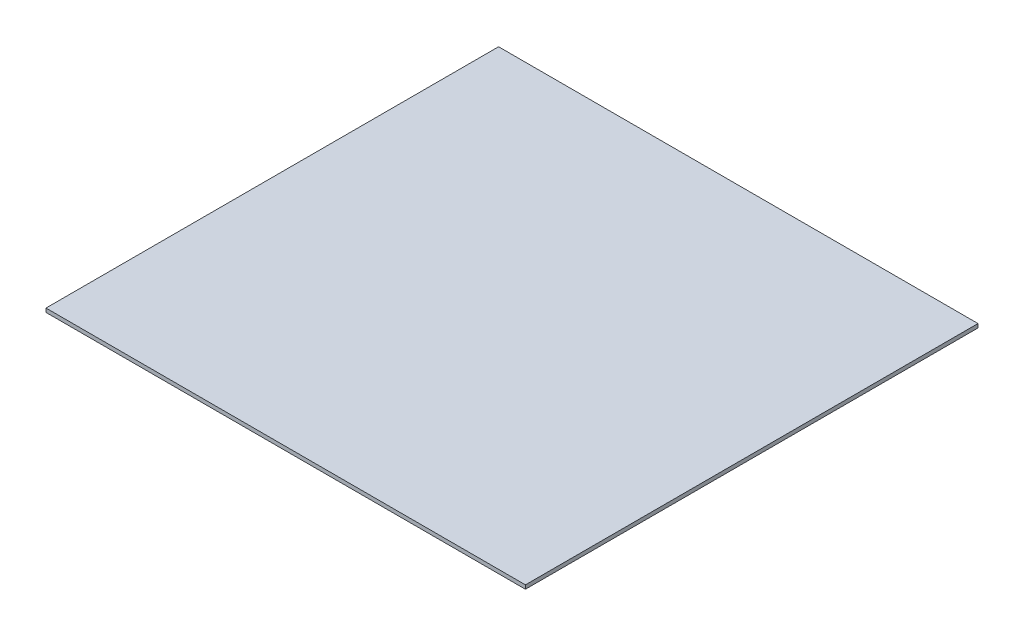
ISO-10303-21;
HEADER;
FILE_DESCRIPTION(('STEP AP214'),'2;1');
FILE_NAME('part.step','',(''),(''),'','','');
FILE_SCHEMA(('AUTOMOTIVE_DESIGN { 1 0 10303 214 1 1 1 1 }'));
ENDSEC;
DATA;
#1=APPLICATION_CONTEXT('core data for automotive mechanical design processes');
#2=APPLICATION_PROTOCOL_DEFINITION('international standard','automotive_design',2000,#1);
#3=PRODUCT_CONTEXT('',#1,'mechanical');
#4=PRODUCT('Part','Part','',(#3));
#5=PRODUCT_RELATED_PRODUCT_CATEGORY('part','',(#4));
#6=PRODUCT_DEFINITION_FORMATION('','',#4);
#7=PRODUCT_DEFINITION_CONTEXT('part definition',#1,'design');
#8=PRODUCT_DEFINITION('design','',#6,#7);
#9=PRODUCT_DEFINITION_SHAPE('','',#8);
#10=(LENGTH_UNIT() NAMED_UNIT(*) SI_UNIT(.MILLI.,.METRE.));
#11=(NAMED_UNIT(*) PLANE_ANGLE_UNIT() SI_UNIT($,.RADIAN.));
#12=(NAMED_UNIT(*) SI_UNIT($,.STERADIAN.) SOLID_ANGLE_UNIT());
#13=UNCERTAINTY_MEASURE_WITH_UNIT(LENGTH_MEASURE(1.E-05),#10,'distance_accuracy_value','');
#14=(GEOMETRIC_REPRESENTATION_CONTEXT(3) GLOBAL_UNCERTAINTY_ASSIGNED_CONTEXT((#13)) GLOBAL_UNIT_ASSIGNED_CONTEXT((#10,
#11,#12)) REPRESENTATION_CONTEXT('',''));
#15=CARTESIAN_POINT('',(0.,0.,0.));
#16=DIRECTION('',(0.,0.,1.));
#17=DIRECTION('',(1.,0.,0.));
#18=AXIS2_PLACEMENT_3D('',#15,#16,#17);
#19=CARTESIAN_POINT('',(312.5,5.,-295.));
#20=DIRECTION('',(-1.,0.,0.));
#21=DIRECTION('',(0.,0.,1.));
#22=AXIS2_PLACEMENT_3D('',#19,#20,#21);
#23=PLANE('',#22);
#24=DIRECTION('',(0.,0.,-1.));
#25=VECTOR('',#24,1.);
#26=CARTESIAN_POINT('',(312.5,0.,-295.));
#27=LINE('',#26,#25);
#28=CARTESIAN_POINT('',(312.5,0.,295.));
#29=VERTEX_POINT('',#28);
#30=CARTESIAN_POINT('',(312.5,0.,-295.));
#31=VERTEX_POINT('',#30);
#32=EDGE_CURVE('E113',#29,#31,#27,.T.);
#33=ORIENTED_EDGE('',*,*,#32,.T.);
#34=DIRECTION('',(0.,-1.,0.));
#35=VECTOR('',#34,1.);
#36=CARTESIAN_POINT('',(312.5,5.,-295.));
#37=LINE('',#36,#35);
#38=CARTESIAN_POINT('',(312.5,5.,-295.));
#39=VERTEX_POINT('',#38);
#40=EDGE_CURVE('E11',#39,#31,#37,.T.);
#41=ORIENTED_EDGE('',*,*,#40,.F.);
#42=DIRECTION('',(0.,0.,-1.));
#43=VECTOR('',#42,1.);
#44=CARTESIAN_POINT('',(312.5,5.,-295.));
#45=LINE('',#44,#43);
#46=CARTESIAN_POINT('',(312.5,5.,295.));
#47=VERTEX_POINT('',#46);
#48=EDGE_CURVE('E97',#47,#39,#45,.T.);
#49=ORIENTED_EDGE('',*,*,#48,.F.);
#50=DIRECTION('',(0.,-1.,0.));
#51=VECTOR('',#50,1.);
#52=CARTESIAN_POINT('',(312.5,5.,295.));
#53=LINE('',#52,#51);
#54=EDGE_CURVE('E109',#47,#29,#53,.T.);
#55=ORIENTED_EDGE('',*,*,#54,.T.);
#56=EDGE_LOOP('',(#33,#41,#49,#55));
#57=FACE_BOUND('',#56,.T.);
#58=ADVANCED_FACE('F45',(#57),#23,.F.);
#59=CARTESIAN_POINT('',(-312.5,5.,-295.));
#60=DIRECTION('',(0.,0.,1.));
#61=DIRECTION('',(1.,0.,0.));
#62=AXIS2_PLACEMENT_3D('',#59,#60,#61);
#63=PLANE('',#62);
#64=DIRECTION('',(-1.,0.,0.));
#65=VECTOR('',#64,1.);
#66=CARTESIAN_POINT('',(-312.5,0.,-295.));
#67=LINE('',#66,#65);
#68=CARTESIAN_POINT('',(-312.5,0.,-295.));
#69=VERTEX_POINT('',#68);
#70=EDGE_CURVE('E102',#31,#69,#67,.T.);
#71=ORIENTED_EDGE('',*,*,#70,.T.);
#72=DIRECTION('',(0.,-1.,0.));
#73=VECTOR('',#72,1.);
#74=CARTESIAN_POINT('',(-312.5,5.,-295.));
#75=LINE('',#74,#73);
#76=CARTESIAN_POINT('',(-312.5,5.,-295.));
#77=VERTEX_POINT('',#76);
#78=EDGE_CURVE('E54',#77,#69,#75,.T.);
#79=ORIENTED_EDGE('',*,*,#78,.F.);
#80=DIRECTION('',(-1.,0.,0.));
#81=VECTOR('',#80,1.);
#82=CARTESIAN_POINT('',(-312.5,5.,-295.));
#83=LINE('',#82,#81);
#84=EDGE_CURVE('E92',#39,#77,#83,.T.);
#85=ORIENTED_EDGE('',*,*,#84,.F.);
#86=ORIENTED_EDGE('',*,*,#40,.T.);
#87=EDGE_LOOP('',(#71,#79,#85,#86));
#88=FACE_BOUND('',#87,.T.);
#89=ADVANCED_FACE('F101',(#88),#63,.F.);
#90=CARTESIAN_POINT('',(-312.5,5.,-295.));
#91=DIRECTION('',(1.,0.,0.));
#92=DIRECTION('',(0.,0.,-1.));
#93=AXIS2_PLACEMENT_3D('',#90,#91,#92);
#94=PLANE('',#93);
#95=DIRECTION('',(0.,0.,1.));
#96=VECTOR('',#95,1.);
#97=CARTESIAN_POINT('',(-312.5,0.,-295.));
#98=LINE('',#97,#96);
#99=CARTESIAN_POINT('',(-312.5,0.,295.));
#100=VERTEX_POINT('',#99);
#101=EDGE_CURVE('E79',#69,#100,#98,.T.);
#102=ORIENTED_EDGE('',*,*,#101,.T.);
#103=DIRECTION('',(0.,-1.,0.));
#104=VECTOR('',#103,1.);
#105=CARTESIAN_POINT('',(-312.5,5.,295.));
#106=LINE('',#105,#104);
#107=CARTESIAN_POINT('',(-312.5,5.,295.));
#108=VERTEX_POINT('',#107);
#109=EDGE_CURVE('E104',#108,#100,#106,.T.);
#110=ORIENTED_EDGE('',*,*,#109,.F.);
#111=DIRECTION('',(0.,0.,1.));
#112=VECTOR('',#111,1.);
#113=CARTESIAN_POINT('',(-312.5,5.,-295.));
#114=LINE('',#113,#112);
#115=EDGE_CURVE('E95',#77,#108,#114,.T.);
#116=ORIENTED_EDGE('',*,*,#115,.F.);
#117=ORIENTED_EDGE('',*,*,#78,.T.);
#118=EDGE_LOOP('',(#102,#110,#116,#117));
#119=FACE_BOUND('',#118,.T.);
#120=ADVANCED_FACE('F105',(#119),#94,.F.);
#121=CARTESIAN_POINT('',(-312.5,5.,295.));
#122=DIRECTION('',(0.,0.,-1.));
#123=DIRECTION('',(-1.,0.,0.));
#124=AXIS2_PLACEMENT_3D('',#121,#122,#123);
#125=PLANE('',#124);
#126=DIRECTION('',(1.,0.,0.));
#127=VECTOR('',#126,1.);
#128=CARTESIAN_POINT('',(-312.5,0.,295.));
#129=LINE('',#128,#127);
#130=EDGE_CURVE('E85',#100,#29,#129,.T.);
#131=ORIENTED_EDGE('',*,*,#130,.T.);
#132=ORIENTED_EDGE('',*,*,#54,.F.);
#133=DIRECTION('',(1.,0.,0.));
#134=VECTOR('',#133,1.);
#135=CARTESIAN_POINT('',(-312.5,5.,295.));
#136=LINE('',#135,#134);
#137=EDGE_CURVE('E62',#108,#47,#136,.T.);
#138=ORIENTED_EDGE('',*,*,#137,.F.);
#139=ORIENTED_EDGE('',*,*,#109,.T.);
#140=EDGE_LOOP('',(#131,#132,#138,#139));
#141=FACE_BOUND('',#140,.T.);
#142=ADVANCED_FACE('F126',(#141),#125,.F.);
#143=CARTESIAN_POINT('',(0.,5.,0.));
#144=DIRECTION('',(0.,1.,0.));
#145=DIRECTION('',(0.,0.,1.));
#146=AXIS2_PLACEMENT_3D('',#143,#144,#145);
#147=PLANE('',#146);
#148=ORIENTED_EDGE('',*,*,#48,.T.);
#149=ORIENTED_EDGE('',*,*,#84,.T.);
#150=ORIENTED_EDGE('',*,*,#115,.T.);
#151=ORIENTED_EDGE('',*,*,#137,.T.);
#152=EDGE_LOOP('',(#148,#149,#150,#151));
#153=FACE_BOUND('',#152,.T.);
#154=ADVANCED_FACE('F93',(#153),#147,.T.);
#155=CARTESIAN_POINT('',(0.,0.,0.));
#156=DIRECTION('',(0.,1.,0.));
#157=DIRECTION('',(0.,0.,1.));
#158=AXIS2_PLACEMENT_3D('',#155,#156,#157);
#159=PLANE('',#158);
#160=ORIENTED_EDGE('',*,*,#32,.F.);
#161=ORIENTED_EDGE('',*,*,#130,.F.);
#162=ORIENTED_EDGE('',*,*,#101,.F.);
#163=ORIENTED_EDGE('',*,*,#70,.F.);
#164=EDGE_LOOP('',(#160,#161,#162,#163));
#165=FACE_BOUND('',#164,.T.);
#166=ADVANCED_FACE('F129',(#165),#159,.F.);
#167=CLOSED_SHELL('',(#58,#89,#120,#142,#154,#166));
#168=MANIFOLD_SOLID_BREP('B2',#167);
#169=ADVANCED_BREP_SHAPE_REPRESENTATION('',(#18,#168),#14);
#170=SHAPE_DEFINITION_REPRESENTATION(#9,#169);
ENDSEC;
END-ISO-10303-21;
